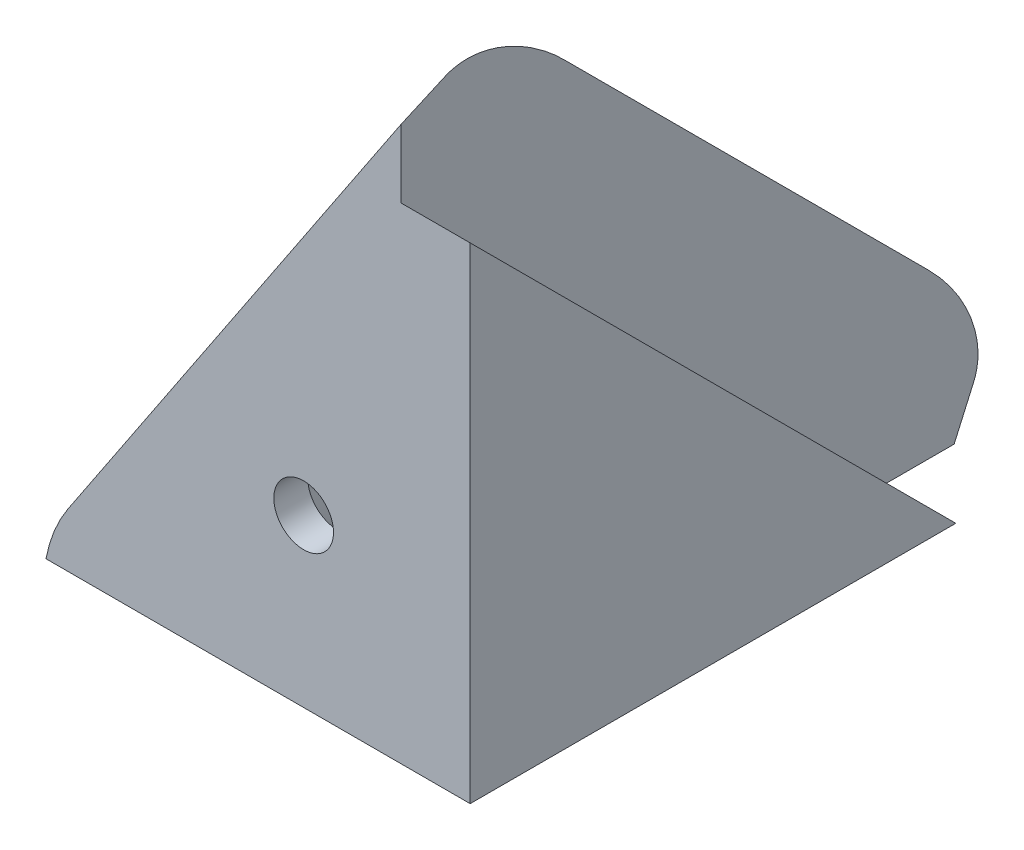
ISO-10303-21;
HEADER;
FILE_DESCRIPTION(('STEP AP214'),'2;1');
FILE_NAME('part.step','',(''),(''),'','','');
FILE_SCHEMA(('AUTOMOTIVE_DESIGN { 1 0 10303 214 1 1 1 1 }'));
ENDSEC;
DATA;
#1=APPLICATION_CONTEXT('core data for automotive mechanical design processes');
#2=APPLICATION_PROTOCOL_DEFINITION('international standard','automotive_design',2000,#1);
#3=PRODUCT_CONTEXT('',#1,'mechanical');
#4=PRODUCT('Part','Part','',(#3));
#5=PRODUCT_RELATED_PRODUCT_CATEGORY('part','',(#4));
#6=PRODUCT_DEFINITION_FORMATION('','',#4);
#7=PRODUCT_DEFINITION_CONTEXT('part definition',#1,'design');
#8=PRODUCT_DEFINITION('design','',#6,#7);
#9=PRODUCT_DEFINITION_SHAPE('','',#8);
#10=(LENGTH_UNIT() NAMED_UNIT(*) SI_UNIT(.MILLI.,.METRE.));
#11=(NAMED_UNIT(*) PLANE_ANGLE_UNIT() SI_UNIT($,.RADIAN.));
#12=(NAMED_UNIT(*) SI_UNIT($,.STERADIAN.) SOLID_ANGLE_UNIT());
#13=UNCERTAINTY_MEASURE_WITH_UNIT(LENGTH_MEASURE(1.E-05),#10,'distance_accuracy_value','');
#14=(GEOMETRIC_REPRESENTATION_CONTEXT(3) GLOBAL_UNCERTAINTY_ASSIGNED_CONTEXT((#13)) GLOBAL_UNIT_ASSIGNED_CONTEXT((#10,
#11,#12)) REPRESENTATION_CONTEXT('',''));
#15=CARTESIAN_POINT('',(0.,0.,0.));
#16=DIRECTION('',(0.,0.,1.));
#17=DIRECTION('',(1.,0.,0.));
#18=AXIS2_PLACEMENT_3D('',#15,#16,#17);
#19=CARTESIAN_POINT('',(0.,0.,0.));
#20=DIRECTION('',(1.,0.,0.));
#21=DIRECTION('',(0.,0.,-1.));
#22=AXIS2_PLACEMENT_3D('',#19,#20,#21);
#23=PLANE('',#22);
#24=DIRECTION('',(0.,0.707106781186548,0.707106781186548));
#25=VECTOR('',#24,1.);
#26=CARTESIAN_POINT('',(0.,17.5,-17.5));
#27=LINE('',#26,#25);
#28=CARTESIAN_POINT('',(0.,0.,-35.));
#29=VERTEX_POINT('',#28);
#30=CARTESIAN_POINT('',(0.,35.,0.));
#31=VERTEX_POINT('',#30);
#32=EDGE_CURVE('E214',#29,#31,#27,.T.);
#33=ORIENTED_EDGE('',*,*,#32,.T.);
#34=DIRECTION('',(0.,-1.,0.));
#35=VECTOR('',#34,1.);
#36=CARTESIAN_POINT('',(0.,0.,0.));
#37=LINE('',#36,#35);
#38=CARTESIAN_POINT('',(0.,0.,0.));
#39=VERTEX_POINT('',#38);
#40=EDGE_CURVE('E67',#31,#39,#37,.T.);
#41=ORIENTED_EDGE('',*,*,#40,.T.);
#42=CARTESIAN_POINT('',(0.,0.,-35.));
#43=DIRECTION('',(0.,0.,1.));
#44=VECTOR('',#43,1.);
#45=LINE('',#42,#44);
#46=EDGE_CURVE('E306',#29,#39,#45,.T.);
#47=ORIENTED_EDGE('',*,*,#46,.F.);
#48=EDGE_LOOP('',(#33,#41,#47));
#49=FACE_BOUND('',#48,.T.);
#50=ADVANCED_FACE('F50',(#49),#23,.T.);
#51=CARTESIAN_POINT('',(0.,0.,0.));
#52=DIRECTION('',(0.,-1.,0.));
#53=DIRECTION('',(0.,0.,1.));
#54=AXIS2_PLACEMENT_3D('',#51,#52,#53);
#55=PLANE('',#54);
#56=CARTESIAN_POINT('',(-12.,0.,-12.));
#57=DIRECTION('',(0.,1.,0.));
#58=DIRECTION('',(0.,0.,1.));
#59=AXIS2_PLACEMENT_3D('',#56,#57,#58);
#60=CIRCLE('',#59,2.1);
#61=CARTESIAN_POINT('',(-12.,0.,-9.9));
#62=VERTEX_POINT('',#61);
#63=EDGE_CURVE('E284',#62,#62,#60,.T.);
#64=ORIENTED_EDGE('',*,*,#63,.T.);
#65=EDGE_LOOP('',(#64));
#66=FACE_BOUND('',#65,.T.);
#67=ORIENTED_EDGE('',*,*,#46,.T.);
#68=DIRECTION('',(-1.,0.,0.));
#69=VECTOR('',#68,1.);
#70=CARTESIAN_POINT('',(0.,0.,0.));
#71=LINE('',#70,#69);
#72=CARTESIAN_POINT('',(-30.5683885482844,0.,0.));
#73=VERTEX_POINT('',#72);
#74=EDGE_CURVE('E374',#39,#73,#71,.T.);
#75=ORIENTED_EDGE('',*,*,#74,.T.);
#76=CARTESIAN_POINT('',(-25.3989526645243,0.,0.));
#77=DIRECTION('',(0.,1.,0.));
#78=DIRECTION('',(-0.348060303070731,0.,0.937472146480263));
#79=AXIS2_PLACEMENT_3D('',#76,#77,#78);
#80=ELLIPSE('',#79,7.31068633663173,5.);
#81=CARTESIAN_POINT('',(-28.9958939606416,0.,-3.88672959491346));
#82=VERTEX_POINT('',#81);
#83=EDGE_CURVE('E341',#82,#73,#80,.T.);
#84=ORIENTED_EDGE('',*,*,#83,.F.);
#85=DIRECTION('',(-0.554700196225229,0.,0.832050294337844));
#86=VECTOR('',#85,1.);
#87=CARTESIAN_POINT('',(-21.8679556319427,0.,-14.5786370879618));
#88=LINE('',#87,#86);
#89=CARTESIAN_POINT('',(-5.,0.,-39.8805705358759));
#90=VERTEX_POINT('',#89);
#91=EDGE_CURVE('E335',#90,#82,#88,.T.);
#92=ORIENTED_EDGE('',*,*,#91,.F.);
#93=DIRECTION('',(0.,0.,-1.));
#94=VECTOR('',#93,1.);
#95=CARTESIAN_POINT('',(-5.,0.,0.));
#96=LINE('',#95,#94);
#97=CARTESIAN_POINT('',(-5.,0.,-35.));
#98=VERTEX_POINT('',#97);
#99=EDGE_CURVE('E208',#98,#90,#96,.T.);
#100=ORIENTED_EDGE('',*,*,#99,.F.);
#101=DIRECTION('',(1.,0.,0.));
#102=VECTOR('',#101,1.);
#103=CARTESIAN_POINT('',(-5.,0.,-35.));
#104=LINE('',#103,#102);
#105=EDGE_CURVE('E199',#98,#29,#104,.T.);
#106=ORIENTED_EDGE('',*,*,#105,.T.);
#107=EDGE_LOOP('',(#67,#75,#84,#92,#100,#106));
#108=FACE_BOUND('',#107,.T.);
#109=ADVANCED_FACE('F47',(#66,#108),#55,.T.);
#110=CARTESIAN_POINT('',(-5.,0.,0.));
#111=DIRECTION('',(1.,0.,0.));
#112=DIRECTION('',(0.,0.,-1.));
#113=AXIS2_PLACEMENT_3D('',#110,#111,#112);
#114=PLANE('',#113);
#115=DIRECTION('',(0.,-0.405101821340606,0.914271575816794));
#116=VECTOR('',#115,1.);
#117=CARTESIAN_POINT('',(-5.,39.1628031074705,1.61992448137227));
#118=LINE('',#117,#116);
#119=CARTESIAN_POINT('',(-5.,41.2894179989949,-3.17961836342447));
#120=VERTEX_POINT('',#119);
#121=CARTESIAN_POINT('',(-5.,39.8805705358759,0.));
#122=VERTEX_POINT('',#121);
#123=EDGE_CURVE('E197',#120,#122,#118,.T.);
#124=ORIENTED_EDGE('',*,*,#123,.T.);
#125=DIRECTION('',(0.,-1.,0.));
#126=VECTOR('',#125,1.);
#127=CARTESIAN_POINT('',(-5.,0.,0.));
#128=LINE('',#127,#126);
#129=CARTESIAN_POINT('',(-5.,35.,0.));
#130=VERTEX_POINT('',#129);
#131=EDGE_CURVE('E194',#122,#130,#128,.T.);
#132=ORIENTED_EDGE('',*,*,#131,.T.);
#133=DIRECTION('',(0.,0.707106781186548,0.707106781186548));
#134=VECTOR('',#133,1.);
#135=CARTESIAN_POINT('',(-5.,17.5,-17.5));
#136=LINE('',#135,#134);
#137=EDGE_CURVE('E202',#98,#130,#136,.T.);
#138=ORIENTED_EDGE('',*,*,#137,.F.);
#139=ORIENTED_EDGE('',*,*,#99,.T.);
#140=DIRECTION('',(0.,-0.914271575816795,0.405101821340604));
#141=VECTOR('',#140,1.);
#142=CARTESIAN_POINT('',(-5.,-9.37115503531224,-35.7283338555672));
#143=LINE('',#142,#141);
#144=CARTESIAN_POINT('',(-5.,3.17961836342447,-41.2894179989949));
#145=VERTEX_POINT('',#144);
#146=EDGE_CURVE('E230',#90,#145,#143,.F.);
#147=ORIENTED_EDGE('',*,*,#146,.T.);
#148=CARTESIAN_POINT('',(-5.,8.41301994640867,-34.3261285046927));
#149=DIRECTION('',(-1.,0.,0.));
#150=DIRECTION('',(0.,0.687278705338442,0.726393819624255));
#151=AXIS2_PLACEMENT_3D('',#148,#149,#150);
#152=ELLIPSE('',#151,8.82760606728839,5.);
#153=CARTESIAN_POINT('',(-5.,11.7446391366902,-38.071300771529));
#154=VERTEX_POINT('',#153);
#155=EDGE_CURVE('E229',#145,#154,#152,.F.);
#156=ORIENTED_EDGE('',*,*,#155,.T.);
#157=DIRECTION('',(0.,-0.707106781186548,-0.707106781186548));
#158=VECTOR('',#157,1.);
#159=CARTESIAN_POINT('',(-5.,24.9079699541096,-24.9079699541096));
#160=LINE('',#159,#158);
#161=CARTESIAN_POINT('',(-5.,38.071300771529,-11.7446391366902));
#162=VERTEX_POINT('',#161);
#163=EDGE_CURVE('E223',#154,#162,#160,.F.);
#164=ORIENTED_EDGE('',*,*,#163,.T.);
#165=CARTESIAN_POINT('',(-5.,34.3261285046927,-8.41301994640865));
#166=DIRECTION('',(-1.,0.,0.));
#167=DIRECTION('',(0.,-0.726393819624255,-0.687278705338442));
#168=AXIS2_PLACEMENT_3D('',#165,#166,#167);
#169=ELLIPSE('',#168,8.82760606728838,5.);
#170=EDGE_CURVE('E12',#162,#120,#169,.F.);
#171=ORIENTED_EDGE('',*,*,#170,.T.);
#172=EDGE_LOOP('',(#124,#132,#138,#139,#147,#156,#164,#171));
#173=FACE_BOUND('',#172,.T.);
#174=ADVANCED_FACE('F205',(#173),#114,.T.);
#175=CARTESIAN_POINT('',(-12.,12.,5.));
#176=DIRECTION('',(0.,0.,1.));
#177=DIRECTION('',(1.,0.,0.));
#178=AXIS2_PLACEMENT_3D('',#175,#176,#177);
#179=CYLINDRICAL_SURFACE('',#178,2.15);
#180=CARTESIAN_POINT('',(-12.,12.,-2.45));
#181=DIRECTION('',(0.,0.,1.));
#182=DIRECTION('',(1.,0.,0.));
#183=AXIS2_PLACEMENT_3D('',#180,#181,#182);
#184=CIRCLE('',#183,2.15);
#185=CARTESIAN_POINT('',(-9.85,12.,-2.45));
#186=VERTEX_POINT('',#185);
#187=EDGE_CURVE('E222',#186,#186,#184,.T.);
#188=ORIENTED_EDGE('',*,*,#187,.F.);
#189=EDGE_LOOP('',(#188));
#190=FACE_BOUND('',#189,.T.);
#191=CARTESIAN_POINT('',(-12.,12.,0.));
#192=DIRECTION('',(0.,0.,1.));
#193=DIRECTION('',(1.,0.,0.));
#194=AXIS2_PLACEMENT_3D('',#191,#192,#193);
#195=CIRCLE('',#194,2.15);
#196=CARTESIAN_POINT('',(-9.85,12.,0.));
#197=VERTEX_POINT('',#196);
#198=EDGE_CURVE('E207',#197,#197,#195,.F.);
#199=ORIENTED_EDGE('',*,*,#198,.F.);
#200=EDGE_LOOP('',(#199));
#201=FACE_BOUND('',#200,.T.);
#202=ADVANCED_FACE('F389',(#190,#201),#179,.F.);
#203=CARTESIAN_POINT('',(0.,25.0502525316942,-25.0502525316942));
#204=DIRECTION('',(0.0402110415282764,-0.706534879584586,0.706534879584586));
#205=DIRECTION('',(0.,-0.707106781186547,-0.707106781186547));
#206=AXIS2_PLACEMENT_3D('',#203,#204,#205);
#207=PLANE('',#206);
#208=DIRECTION('',(0.566404975696414,-0.56640497569641,-0.598640799655932));
#209=VECTOR('',#208,1.);
#210=CARTESIAN_POINT('',(-12.0796495610013,18.8242886976915,-30.5887268953539));
#211=LINE('',#210,#209);
#212=CARTESIAN_POINT('',(-6.85994340570037,13.6045825423906,-36.1055023490589));
#213=VERTEX_POINT('',#212);
#214=EDGE_CURVE('E725',#213,#154,#211,.T.);
#215=ORIENTED_EDGE('',*,*,#214,.F.);
#216=DIRECTION('',(0.,0.707106781186548,0.707106781186548));
#217=VECTOR('',#216,1.);
#218=CARTESIAN_POINT('',(-6.85994340570037,-5.14495755427527,-54.8550424457247));
#219=LINE('',#218,#217);
#220=CARTESIAN_POINT('',(-6.85994340570037,36.1055023490589,-13.6045825423906));
#221=VERTEX_POINT('',#220);
#222=EDGE_CURVE('E311',#213,#221,#219,.T.);
#223=ORIENTED_EDGE('',*,*,#222,.T.);
#224=DIRECTION('',(0.566404975696415,0.598640799655932,0.566404975696409));
#225=VECTOR('',#224,1.);
#226=CARTESIAN_POINT('',(-12.0796495610013,30.5887268953539,-18.8242886976915));
#227=LINE('',#226,#225);
#228=EDGE_CURVE('E717',#162,#221,#227,.F.);
#229=ORIENTED_EDGE('',*,*,#228,.F.);
#230=ORIENTED_EDGE('',*,*,#163,.F.);
#231=EDGE_LOOP('',(#215,#223,#229,#230));
#232=FACE_BOUND('',#231,.T.);
#233=ADVANCED_FACE('F392',(#232),#207,.F.);
#234=CARTESIAN_POINT('',(-21.8679556319427,0.,-14.5786370879618));
#235=DIRECTION('',(0.808003192842465,0.23867712375438,0.53866879522831));
#236=DIRECTION('',(-0.554700196225229,0.,0.832050294337844));
#237=AXIS2_PLACEMENT_3D('',#234,#235,#236);
#238=PLANE('',#237);
#239=ORIENTED_EDGE('',*,*,#91,.T.);
#240=DIRECTION('',(0.253926469367306,0.683930313758155,-0.683930313758154));
#241=VECTOR('',#240,1.);
#242=CARTESIAN_POINT('',(-26.6794518107825,6.23914872011261,-10.1258783150261));
#243=LINE('',#242,#241);
#244=CARTESIAN_POINT('',(-27.1395171905289,5.,-8.88672959491345));
#245=VERTEX_POINT('',#244);
#246=EDGE_CURVE('E708',#245,#82,#243,.F.);
#247=ORIENTED_EDGE('',*,*,#246,.F.);
#248=DIRECTION('',(-0.554700196225229,0.,0.832050294337844));
#249=VECTOR('',#248,1.);
#250=CARTESIAN_POINT('',(-22.8904640218647,5.,-15.2603093479098));
#251=LINE('',#250,#249);
#252=CARTESIAN_POINT('',(-9.,5.,-36.0960053807068));
#253=VERTEX_POINT('',#252);
#254=EDGE_CURVE('E353',#245,#253,#251,.F.);
#255=ORIENTED_EDGE('',*,*,#254,.T.);
#256=DIRECTION('',(0.,-0.914271575816795,0.405101821340604));
#257=VECTOR('',#256,1.);
#258=CARTESIAN_POINT('',(-9.,-7.14891655193227,-30.712978769488));
#259=LINE('',#258,#257);
#260=CARTESIAN_POINT('',(-9.,7.17961836342444,-37.0617658748596));
#261=VERTEX_POINT('',#260);
#262=EDGE_CURVE('E319',#253,#261,#259,.F.);
#263=ORIENTED_EDGE('',*,*,#262,.T.);
#264=DIRECTION('',(0.566404975696415,-0.56640497569641,-0.598640799655932));
#265=VECTOR('',#264,1.);
#266=CARTESIAN_POINT('',(-18.4483264210769,16.6279447845013,-27.0757065589623));
#267=LINE('',#266,#265);
#268=EDGE_CURVE('E707',#145,#261,#267,.F.);
#269=ORIENTED_EDGE('',*,*,#268,.F.);
#270=ORIENTED_EDGE('',*,*,#146,.F.);
#271=EDGE_LOOP('',(#239,#247,#255,#263,#269,#270));
#272=FACE_BOUND('',#271,.T.);
#273=ADVANCED_FACE('F428',(#272),#238,.F.);
#274=CARTESIAN_POINT('',(-23.6562709283298,15.7708472855532,-8.74474632195212));
#275=DIRECTION('',(-0.808003192842464,0.53866879522831,0.238677123754382));
#276=DIRECTION('',(0.554700196225229,0.832050294337844,0.));
#277=AXIS2_PLACEMENT_3D('',#274,#275,#276);
#278=PLANE('',#277);
#279=DIRECTION('',(-0.566404975696415,-0.598640799655932,-0.566404975696409));
#280=VECTOR('',#279,1.);
#281=CARTESIAN_POINT('',(-21.4232398935771,23.9314817436788,-19.6028582570014));
#282=LINE('',#281,#280);
#283=CARTESIAN_POINT('',(-9.,37.0617658748596,-7.17961836342443));
#284=VERTEX_POINT('',#283);
#285=EDGE_CURVE('E340',#284,#120,#282,.F.);
#286=ORIENTED_EDGE('',*,*,#285,.F.);
#287=DIRECTION('',(0.,-0.405101821340606,0.914271575816794));
#288=VECTOR('',#287,1.);
#289=CARTESIAN_POINT('',(-9.,34.1474480213914,-0.602314002007703));
#290=LINE('',#289,#288);
#291=CARTESIAN_POINT('',(-9.,36.0960053807069,-5.));
#292=VERTEX_POINT('',#291);
#293=EDGE_CURVE('E318',#284,#292,#290,.T.);
#294=ORIENTED_EDGE('',*,*,#293,.T.);
#295=DIRECTION('',(-0.554700196225229,-0.832050294337844,0.));
#296=VECTOR('',#295,1.);
#297=CARTESIAN_POINT('',(-22.8904640218647,15.2603093479098,-5.));
#298=LINE('',#297,#296);
#299=CARTESIAN_POINT('',(-27.1395171905289,8.88672959491345,-5.));
#300=VERTEX_POINT('',#299);
#301=EDGE_CURVE('E325',#292,#300,#298,.T.);
#302=ORIENTED_EDGE('',*,*,#301,.T.);
#303=DIRECTION('',(-0.253926469367306,-0.683930313758155,0.683930313758153));
#304=VECTOR('',#303,1.);
#305=CARTESIAN_POINT('',(-25.0690285072951,14.4634226363486,-10.5766930414351));
#306=LINE('',#305,#304);
#307=CARTESIAN_POINT('',(-28.9958939606416,3.88672959491342,0.));
#308=VERTEX_POINT('',#307);
#309=EDGE_CURVE('E337',#308,#300,#306,.F.);
#310=ORIENTED_EDGE('',*,*,#309,.F.);
#311=DIRECTION('',(0.554700196225229,0.832050294337844,0.));
#312=VECTOR('',#311,1.);
#313=CARTESIAN_POINT('',(5.82435206036499,56.1170986264234,0.));
#314=LINE('',#313,#312);
#315=EDGE_CURVE('E328',#308,#122,#314,.T.);
#316=ORIENTED_EDGE('',*,*,#315,.T.);
#317=ORIENTED_EDGE('',*,*,#123,.F.);
#318=EDGE_LOOP('',(#286,#294,#302,#310,#316,#317));
#319=FACE_BOUND('',#318,.T.);
#320=ADVANCED_FACE('F424',(#319),#278,.T.);
#321=CARTESIAN_POINT('',(-14.4083104568646,17.8213304032732,-24.3823625828208));
#322=DIRECTION('',(-0.566404975696414,0.56640497569641,0.598640799655932));
#323=DIRECTION('',(-0.726393819624252,0.,-0.687278705338445));
#324=AXIS2_PLACEMENT_3D('',#321,#322,#323);
#325=CYLINDRICAL_SURFACE('',#324,5.);
#326=ORIENTED_EDGE('',*,*,#268,.T.);
#327=CARTESIAN_POINT('',(-9.,12.4130199464086,-30.0984763805574));
#328=DIRECTION('',(-1.,0.,0.));
#329=DIRECTION('',(0.,0.687278705338442,0.726393819624255));
#330=AXIS2_PLACEMENT_3D('',#327,#328,#329);
#331=ELLIPSE('',#330,8.82760606728839,5.);
#332=CARTESIAN_POINT('',(-9.,9.1386762863587,-37.3613237136413));
#333=VERTEX_POINT('',#332);
#334=EDGE_CURVE('E704',#261,#333,#331,.F.);
#335=ORIENTED_EDGE('',*,*,#334,.T.);
#336=CARTESIAN_POINT('',(-11.7638692322829,15.1768891786915,-27.1773069728842));
#337=DIRECTION('',(0.727606875108999,-0.485071250072666,0.485071250072666));
#338=DIRECTION('',(-0.302732240434554,0.407478411677827,0.861576772329658));
#339=AXIS2_PLACEMENT_3D('',#336,#337,#338);
#340=ELLIPSE('',#339,12.610865810412,5.);
#341=EDGE_CURVE('E720',#333,#213,#340,.T.);
#342=ORIENTED_EDGE('',*,*,#341,.T.);
#343=ORIENTED_EDGE('',*,*,#214,.T.);
#344=ORIENTED_EDGE('',*,*,#155,.F.);
#345=EDGE_LOOP('',(#326,#335,#342,#343,#344));
#346=FACE_BOUND('',#345,.T.);
#347=ADVANCED_FACE('F416',(#346),#325,.T.);
#348=CARTESIAN_POINT('',(-17.3832239293648,21.2381377675373,-20.7962438757733));
#349=DIRECTION('',(-0.566404975696415,-0.598640799655932,-0.566404975696409));
#350=DIRECTION('',(0.726393819624252,-0.687278705338446,0.));
#351=AXIS2_PLACEMENT_3D('',#348,#349,#350);
#352=CYLINDRICAL_SURFACE('',#351,5.);
#353=ORIENTED_EDGE('',*,*,#228,.T.);
#354=CARTESIAN_POINT('',(-11.7638692322829,27.1773069728842,-15.1768891786915));
#355=DIRECTION('',(0.727606875108999,-0.485071250072666,0.485071250072666));
#356=DIRECTION('',(-0.302732240434555,-0.861576772329658,-0.407478411677826));
#357=AXIS2_PLACEMENT_3D('',#354,#355,#356);
#358=ELLIPSE('',#357,12.610865810412,5.);
#359=CARTESIAN_POINT('',(-9.,37.3613237136413,-9.13867628635869));
#360=VERTEX_POINT('',#359);
#361=EDGE_CURVE('E714',#221,#360,#358,.T.);
#362=ORIENTED_EDGE('',*,*,#361,.T.);
#363=CARTESIAN_POINT('',(-9.,30.0984763805574,-12.4130199464086));
#364=DIRECTION('',(-1.,0.,0.));
#365=DIRECTION('',(0.,-0.726393819624255,-0.687278705338442));
#366=AXIS2_PLACEMENT_3D('',#363,#364,#365);
#367=ELLIPSE('',#366,8.82760606728838,5.);
#368=EDGE_CURVE('E713',#360,#284,#367,.F.);
#369=ORIENTED_EDGE('',*,*,#368,.T.);
#370=ORIENTED_EDGE('',*,*,#285,.T.);
#371=ORIENTED_EDGE('',*,*,#170,.F.);
#372=EDGE_LOOP('',(#353,#362,#369,#370,#371));
#373=FACE_BOUND('',#372,.T.);
#374=ADVANCED_FACE('F415',(#373),#352,.T.);
#375=CARTESIAN_POINT('',(-12.,-0.00500999999999974,-12.));
#376=DIRECTION('',(0.,1.,0.));
#377=DIRECTION('',(0.,0.,-1.));
#378=AXIS2_PLACEMENT_3D('',#375,#376,#377);
#379=CYLINDRICAL_SURFACE('',#378,2.1);
#380=ORIENTED_EDGE('',*,*,#63,.F.);
#381=EDGE_LOOP('',(#380));
#382=FACE_BOUND('',#381,.T.);
#383=CARTESIAN_POINT('',(-12.,2.5,-12.));
#384=DIRECTION('',(0.,-1.,0.));
#385=DIRECTION('',(0.,0.,-1.));
#386=AXIS2_PLACEMENT_3D('',#383,#384,#385);
#387=CIRCLE('',#386,2.1);
#388=CARTESIAN_POINT('',(-12.,2.5,-14.1));
#389=VERTEX_POINT('',#388);
#390=EDGE_CURVE('E273',#389,#389,#387,.F.);
#391=ORIENTED_EDGE('',*,*,#390,.T.);
#392=EDGE_LOOP('',(#391));
#393=FACE_BOUND('',#392,.T.);
#394=ADVANCED_FACE('F412',(#382,#393),#379,.F.);
#395=CARTESIAN_POINT('',(0.,0.,-60.));
#396=DIRECTION('',(-0.727606875108999,0.485071250072666,-0.485071250072666));
#397=DIRECTION('',(0.,0.707106781186547,0.707106781186547));
#398=AXIS2_PLACEMENT_3D('',#395,#396,#397);
#399=PLANE('',#398);
#400=DIRECTION('',(0.,-0.707106781186547,-0.707106781186547));
#401=VECTOR('',#400,1.);
#402=CARTESIAN_POINT('',(-9.,23.25,-23.25));
#403=LINE('',#402,#401);
#404=EDGE_CURVE('E301',#360,#333,#403,.T.);
#405=ORIENTED_EDGE('',*,*,#404,.F.);
#406=ORIENTED_EDGE('',*,*,#361,.F.);
#407=ORIENTED_EDGE('',*,*,#222,.F.);
#408=ORIENTED_EDGE('',*,*,#341,.F.);
#409=EDGE_LOOP('',(#405,#406,#407,#408));
#410=FACE_BOUND('',#409,.T.);
#411=ADVANCED_FACE('F440',(#410),#399,.T.);
#412=CARTESIAN_POINT('',(0.,0.,-5.));
#413=DIRECTION('',(0.,0.,-1.));
#414=DIRECTION('',(1.,0.,0.));
#415=AXIS2_PLACEMENT_3D('',#412,#413,#414);
#416=PLANE('',#415);
#417=CARTESIAN_POINT('',(-12.,12.,-5.));
#418=DIRECTION('',(0.,0.,1.));
#419=DIRECTION('',(1.,0.,0.));
#420=AXIS2_PLACEMENT_3D('',#417,#418,#419);
#421=CIRCLE('',#420,4.7);
#422=CARTESIAN_POINT('',(-7.3,12.,-5.));
#423=VERTEX_POINT('',#422);
#424=EDGE_CURVE('E372',#423,#423,#421,.T.);
#425=ORIENTED_EDGE('',*,*,#424,.T.);
#426=EDGE_LOOP('',(#425));
#427=FACE_BOUND('',#426,.T.);
#428=ORIENTED_EDGE('',*,*,#301,.F.);
#429=DIRECTION('',(0.,1.,0.));
#430=VECTOR('',#429,1.);
#431=CARTESIAN_POINT('',(-9.,0.,-5.));
#432=LINE('',#431,#430);
#433=CARTESIAN_POINT('',(-9.,22.5,-5.));
#434=VERTEX_POINT('',#433);
#435=EDGE_CURVE('E304',#434,#292,#432,.T.);
#436=ORIENTED_EDGE('',*,*,#435,.F.);
#437=DIRECTION('',(-1.,0.,0.));
#438=VECTOR('',#437,1.);
#439=CARTESIAN_POINT('',(-4.,22.5,-5.));
#440=LINE('',#439,#438);
#441=CARTESIAN_POINT('',(-4.,22.5,-5.));
#442=VERTEX_POINT('',#441);
#443=EDGE_CURVE('E299',#442,#434,#440,.T.);
#444=ORIENTED_EDGE('',*,*,#443,.F.);
#445=DIRECTION('',(0.,-1.,0.));
#446=VECTOR('',#445,1.);
#447=CARTESIAN_POINT('',(-4.,22.5,-5.));
#448=LINE('',#447,#446);
#449=CARTESIAN_POINT('',(-4.,5.,-5.));
#450=VERTEX_POINT('',#449);
#451=EDGE_CURVE('E290',#442,#450,#448,.T.);
#452=ORIENTED_EDGE('',*,*,#451,.T.);
#453=DIRECTION('',(1.,0.,0.));
#454=VECTOR('',#453,1.);
#455=CARTESIAN_POINT('',(0.,5.,-5.));
#456=LINE('',#455,#454);
#457=CARTESIAN_POINT('',(-28.7120117781717,5.,-5.));
#458=VERTEX_POINT('',#457);
#459=EDGE_CURVE('E305',#458,#450,#456,.T.);
#460=ORIENTED_EDGE('',*,*,#459,.F.);
#461=CARTESIAN_POINT('',(-23.5425758944116,4.99999999999999,-5.));
#462=DIRECTION('',(0.,0.,1.));
#463=DIRECTION('',(-0.34806030307073,-0.937472146480263,0.));
#464=AXIS2_PLACEMENT_3D('',#461,#462,#463);
#465=ELLIPSE('',#464,7.31068633663175,5.);
#466=EDGE_CURVE('E342',#300,#458,#465,.T.);
#467=ORIENTED_EDGE('',*,*,#466,.F.);
#468=EDGE_LOOP('',(#428,#436,#444,#452,#460,#467));
#469=FACE_BOUND('',#468,.T.);
#470=ADVANCED_FACE('F438',(#427,#469),#416,.T.);
#471=CARTESIAN_POINT('',(-9.,0.,0.));
#472=DIRECTION('',(1.,0.,0.));
#473=DIRECTION('',(0.,0.,1.));
#474=AXIS2_PLACEMENT_3D('',#471,#472,#473);
#475=PLANE('',#474);
#476=ORIENTED_EDGE('',*,*,#262,.F.);
#477=DIRECTION('',(0.,0.,1.));
#478=VECTOR('',#477,1.);
#479=CARTESIAN_POINT('',(-9.,5.,0.));
#480=LINE('',#479,#478);
#481=CARTESIAN_POINT('',(-9.,5.,-22.5));
#482=VERTEX_POINT('',#481);
#483=EDGE_CURVE('E298',#253,#482,#480,.T.);
#484=ORIENTED_EDGE('',*,*,#483,.T.);
#485=DIRECTION('',(0.,0.707106781186548,0.707106781186548));
#486=VECTOR('',#485,1.);
#487=CARTESIAN_POINT('',(-9.,22.5,-5.));
#488=LINE('',#487,#486);
#489=EDGE_CURVE('E287',#482,#434,#488,.T.);
#490=ORIENTED_EDGE('',*,*,#489,.T.);
#491=ORIENTED_EDGE('',*,*,#435,.T.);
#492=ORIENTED_EDGE('',*,*,#293,.F.);
#493=ORIENTED_EDGE('',*,*,#368,.F.);
#494=ORIENTED_EDGE('',*,*,#404,.T.);
#495=ORIENTED_EDGE('',*,*,#334,.F.);
#496=EDGE_LOOP('',(#476,#484,#490,#491,#492,#493,#494,#495));
#497=FACE_BOUND('',#496,.T.);
#498=ADVANCED_FACE('F447',(#497),#475,.F.);
#499=CARTESIAN_POINT('',(0.,5.,0.));
#500=DIRECTION('',(0.,-1.,0.));
#501=DIRECTION('',(0.,0.,-1.));
#502=AXIS2_PLACEMENT_3D('',#499,#500,#501);
#503=PLANE('',#502);
#504=DIRECTION('',(-0.866025403784439,0.,-0.5));
#505=VECTOR('',#504,1.);
#506=CARTESIAN_POINT('',(-12.,5.,-7.95854811567262));
#507=LINE('',#506,#505);
#508=CARTESIAN_POINT('',(-12.,5.,-7.95854811567262));
#509=VERTEX_POINT('',#508);
#510=CARTESIAN_POINT('',(-15.5,5.,-9.97927405783631));
#511=VERTEX_POINT('',#510);
#512=EDGE_CURVE('E257',#509,#511,#507,.T.);
#513=ORIENTED_EDGE('',*,*,#512,.T.);
#514=DIRECTION('',(0.,0.,-1.));
#515=VECTOR('',#514,1.);
#516=CARTESIAN_POINT('',(-15.5,5.,-9.97927405783631));
#517=LINE('',#516,#515);
#518=CARTESIAN_POINT('',(-15.5,5.,-14.0207259421637));
#519=VERTEX_POINT('',#518);
#520=EDGE_CURVE('E259',#511,#519,#517,.T.);
#521=ORIENTED_EDGE('',*,*,#520,.T.);
#522=DIRECTION('',(0.866025403784439,0.,-0.5));
#523=VECTOR('',#522,1.);
#524=CARTESIAN_POINT('',(-15.5,5.,-14.0207259421637));
#525=LINE('',#524,#523);
#526=CARTESIAN_POINT('',(-12.,5.,-16.0414518843274));
#527=VERTEX_POINT('',#526);
#528=EDGE_CURVE('E261',#519,#527,#525,.T.);
#529=ORIENTED_EDGE('',*,*,#528,.T.);
#530=DIRECTION('',(0.866025403784439,0.,0.5));
#531=VECTOR('',#530,1.);
#532=CARTESIAN_POINT('',(-12.,5.,-16.0414518843274));
#533=LINE('',#532,#531);
#534=CARTESIAN_POINT('',(-8.5,5.,-14.0207259421637));
#535=VERTEX_POINT('',#534);
#536=EDGE_CURVE('E266',#527,#535,#533,.T.);
#537=ORIENTED_EDGE('',*,*,#536,.T.);
#538=DIRECTION('',(0.,0.,1.));
#539=VECTOR('',#538,1.);
#540=CARTESIAN_POINT('',(-8.5,5.,-14.0207259421637));
#541=LINE('',#540,#539);
#542=CARTESIAN_POINT('',(-8.5,5.,-9.97927405783631));
#543=VERTEX_POINT('',#542);
#544=EDGE_CURVE('E236',#535,#543,#541,.T.);
#545=ORIENTED_EDGE('',*,*,#544,.T.);
#546=DIRECTION('',(-0.866025403784439,0.,0.5));
#547=VECTOR('',#546,1.);
#548=CARTESIAN_POINT('',(-8.5,5.,-9.97927405783631));
#549=LINE('',#548,#547);
#550=EDGE_CURVE('E235',#543,#509,#549,.T.);
#551=ORIENTED_EDGE('',*,*,#550,.T.);
#552=EDGE_LOOP('',(#513,#521,#529,#537,#545,#551));
#553=FACE_BOUND('',#552,.T.);
#554=ORIENTED_EDGE('',*,*,#459,.T.);
#555=DIRECTION('',(0.,0.,-1.));
#556=VECTOR('',#555,1.);
#557=CARTESIAN_POINT('',(-4.,5.,-5.));
#558=LINE('',#557,#556);
#559=CARTESIAN_POINT('',(-4.,5.,-22.5));
#560=VERTEX_POINT('',#559);
#561=EDGE_CURVE('E288',#450,#560,#558,.T.);
#562=ORIENTED_EDGE('',*,*,#561,.T.);
#563=DIRECTION('',(-1.,0.,0.));
#564=VECTOR('',#563,1.);
#565=CARTESIAN_POINT('',(-4.,5.,-22.5));
#566=LINE('',#565,#564);
#567=EDGE_CURVE('E293',#560,#482,#566,.T.);
#568=ORIENTED_EDGE('',*,*,#567,.T.);
#569=ORIENTED_EDGE('',*,*,#483,.F.);
#570=ORIENTED_EDGE('',*,*,#254,.F.);
#571=CARTESIAN_POINT('',(-23.5425758944116,5.,-5.00000000000001));
#572=DIRECTION('',(0.,1.,0.));
#573=DIRECTION('',(-0.348060303070731,0.,0.937472146480263));
#574=AXIS2_PLACEMENT_3D('',#571,#572,#573);
#575=ELLIPSE('',#574,7.31068633663173,5.);
#576=EDGE_CURVE('E350',#458,#245,#575,.F.);
#577=ORIENTED_EDGE('',*,*,#576,.F.);
#578=EDGE_LOOP('',(#554,#562,#568,#569,#570,#577));
#579=FACE_BOUND('',#578,.T.);
#580=ADVANCED_FACE('F444',(#553,#579),#503,.F.);
#581=CARTESIAN_POINT('',(-4.,22.5,-5.));
#582=DIRECTION('',(0.,0.707106781186548,-0.707106781186548));
#583=DIRECTION('',(0.,-0.707106781186548,-0.707106781186548));
#584=AXIS2_PLACEMENT_3D('',#581,#582,#583);
#585=PLANE('',#584);
#586=ORIENTED_EDGE('',*,*,#489,.F.);
#587=ORIENTED_EDGE('',*,*,#567,.F.);
#588=DIRECTION('',(0.,0.707106781186548,0.707106781186548));
#589=VECTOR('',#588,1.);
#590=CARTESIAN_POINT('',(-4.,22.5,-5.));
#591=LINE('',#590,#589);
#592=EDGE_CURVE('E295',#560,#442,#591,.T.);
#593=ORIENTED_EDGE('',*,*,#592,.T.);
#594=ORIENTED_EDGE('',*,*,#443,.T.);
#595=EDGE_LOOP('',(#586,#587,#593,#594));
#596=FACE_BOUND('',#595,.T.);
#597=ADVANCED_FACE('F443',(#596),#585,.F.);
#598=CARTESIAN_POINT('',(-4.,0.,0.));
#599=DIRECTION('',(-1.,0.,0.));
#600=DIRECTION('',(0.,0.,-1.));
#601=AXIS2_PLACEMENT_3D('',#598,#599,#600);
#602=PLANE('',#601);
#603=ORIENTED_EDGE('',*,*,#451,.F.);
#604=ORIENTED_EDGE('',*,*,#592,.F.);
#605=ORIENTED_EDGE('',*,*,#561,.F.);
#606=EDGE_LOOP('',(#603,#604,#605));
#607=FACE_BOUND('',#606,.T.);
#608=ADVANCED_FACE('F457',(#607),#602,.T.);
#609=CARTESIAN_POINT('',(0.,2.5,0.));
#610=DIRECTION('',(0.,1.,0.));
#611=DIRECTION('',(0.,0.,-1.));
#612=AXIS2_PLACEMENT_3D('',#609,#610,#611);
#613=PLANE('',#612);
#614=DIRECTION('',(-0.866025403784439,0.,0.5));
#615=VECTOR('',#614,1.);
#616=CARTESIAN_POINT('',(-8.5,2.5,-9.97927405783631));
#617=LINE('',#616,#615);
#618=CARTESIAN_POINT('',(-8.5,2.5,-9.97927405783631));
#619=VERTEX_POINT('',#618);
#620=CARTESIAN_POINT('',(-12.,2.5,-7.95854811567262));
#621=VERTEX_POINT('',#620);
#622=EDGE_CURVE('E233',#619,#621,#617,.T.);
#623=ORIENTED_EDGE('',*,*,#622,.F.);
#624=DIRECTION('',(0.,0.,1.));
#625=VECTOR('',#624,1.);
#626=CARTESIAN_POINT('',(-8.5,2.5,-14.0207259421637));
#627=LINE('',#626,#625);
#628=CARTESIAN_POINT('',(-8.5,2.5,-14.0207259421637));
#629=VERTEX_POINT('',#628);
#630=EDGE_CURVE('E253',#629,#619,#627,.T.);
#631=ORIENTED_EDGE('',*,*,#630,.F.);
#632=DIRECTION('',(0.866025403784439,0.,0.5));
#633=VECTOR('',#632,1.);
#634=CARTESIAN_POINT('',(-12.,2.5,-16.0414518843274));
#635=LINE('',#634,#633);
#636=CARTESIAN_POINT('',(-12.,2.5,-16.0414518843274));
#637=VERTEX_POINT('',#636);
#638=EDGE_CURVE('E250',#637,#629,#635,.T.);
#639=ORIENTED_EDGE('',*,*,#638,.F.);
#640=DIRECTION('',(0.866025403784439,0.,-0.5));
#641=VECTOR('',#640,1.);
#642=CARTESIAN_POINT('',(-15.5,2.5,-14.0207259421637));
#643=LINE('',#642,#641);
#644=CARTESIAN_POINT('',(-15.5,2.5,-14.0207259421637));
#645=VERTEX_POINT('',#644);
#646=EDGE_CURVE('E243',#645,#637,#643,.T.);
#647=ORIENTED_EDGE('',*,*,#646,.F.);
#648=DIRECTION('',(0.,0.,-1.));
#649=VECTOR('',#648,1.);
#650=CARTESIAN_POINT('',(-15.5,2.5,-9.97927405783631));
#651=LINE('',#650,#649);
#652=CARTESIAN_POINT('',(-15.5,2.5,-9.97927405783631));
#653=VERTEX_POINT('',#652);
#654=EDGE_CURVE('E244',#653,#645,#651,.T.);
#655=ORIENTED_EDGE('',*,*,#654,.F.);
#656=DIRECTION('',(-0.866025403784439,0.,-0.5));
#657=VECTOR('',#656,1.);
#658=CARTESIAN_POINT('',(-12.,2.5,-7.95854811567262));
#659=LINE('',#658,#657);
#660=EDGE_CURVE('E239',#621,#653,#659,.T.);
#661=ORIENTED_EDGE('',*,*,#660,.F.);
#662=EDGE_LOOP('',(#623,#631,#639,#647,#655,#661));
#663=FACE_BOUND('',#662,.T.);
#664=ORIENTED_EDGE('',*,*,#390,.F.);
#665=EDGE_LOOP('',(#664));
#666=FACE_BOUND('',#665,.T.);
#667=ADVANCED_FACE('F458',(#663,#666),#613,.T.);
#668=CARTESIAN_POINT('',(-8.5,2.5,-9.97927405783631));
#669=DIRECTION('',(0.5,0.,0.866025403784439));
#670=DIRECTION('',(-0.866025403784439,0.,0.5));
#671=AXIS2_PLACEMENT_3D('',#668,#669,#670);
#672=PLANE('',#671);
#673=ORIENTED_EDGE('',*,*,#550,.F.);
#674=DIRECTION('',(0.,1.,0.));
#675=VECTOR('',#674,1.);
#676=CARTESIAN_POINT('',(-8.5,2.5,-9.97927405783631));
#677=LINE('',#676,#675);
#678=EDGE_CURVE('E271',#619,#543,#677,.T.);
#679=ORIENTED_EDGE('',*,*,#678,.F.);
#680=ORIENTED_EDGE('',*,*,#622,.T.);
#681=DIRECTION('',(0.,1.,0.));
#682=VECTOR('',#681,1.);
#683=CARTESIAN_POINT('',(-12.,2.5,-7.95854811567262));
#684=LINE('',#683,#682);
#685=EDGE_CURVE('E255',#621,#509,#684,.T.);
#686=ORIENTED_EDGE('',*,*,#685,.T.);
#687=EDGE_LOOP('',(#673,#679,#680,#686));
#688=FACE_BOUND('',#687,.T.);
#689=ADVANCED_FACE('F463',(#688),#672,.F.);
#690=CARTESIAN_POINT('',(-8.5,2.5,-14.0207259421637));
#691=DIRECTION('',(1.,0.,0.));
#692=DIRECTION('',(0.,0.,1.));
#693=AXIS2_PLACEMENT_3D('',#690,#691,#692);
#694=PLANE('',#693);
#695=ORIENTED_EDGE('',*,*,#544,.F.);
#696=DIRECTION('',(0.,1.,0.));
#697=VECTOR('',#696,1.);
#698=CARTESIAN_POINT('',(-8.5,2.5,-14.0207259421637));
#699=LINE('',#698,#697);
#700=EDGE_CURVE('E272',#629,#535,#699,.T.);
#701=ORIENTED_EDGE('',*,*,#700,.F.);
#702=ORIENTED_EDGE('',*,*,#630,.T.);
#703=ORIENTED_EDGE('',*,*,#678,.T.);
#704=EDGE_LOOP('',(#695,#701,#702,#703));
#705=FACE_BOUND('',#704,.T.);
#706=ADVANCED_FACE('F470',(#705),#694,.F.);
#707=CARTESIAN_POINT('',(-12.,2.5,-16.0414518843274));
#708=DIRECTION('',(0.5,0.,-0.866025403784439));
#709=DIRECTION('',(0.866025403784439,0.,0.5));
#710=AXIS2_PLACEMENT_3D('',#707,#708,#709);
#711=PLANE('',#710);
#712=ORIENTED_EDGE('',*,*,#536,.F.);
#713=DIRECTION('',(0.,1.,0.));
#714=VECTOR('',#713,1.);
#715=CARTESIAN_POINT('',(-12.,2.5,-16.0414518843274));
#716=LINE('',#715,#714);
#717=EDGE_CURVE('E276',#637,#527,#716,.T.);
#718=ORIENTED_EDGE('',*,*,#717,.F.);
#719=ORIENTED_EDGE('',*,*,#638,.T.);
#720=ORIENTED_EDGE('',*,*,#700,.T.);
#721=EDGE_LOOP('',(#712,#718,#719,#720));
#722=FACE_BOUND('',#721,.T.);
#723=ADVANCED_FACE('F476',(#722),#711,.F.);
#724=CARTESIAN_POINT('',(-15.5,2.5,-14.0207259421637));
#725=DIRECTION('',(-0.5,0.,-0.866025403784438));
#726=DIRECTION('',(0.866025403784439,0.,-0.5));
#727=AXIS2_PLACEMENT_3D('',#724,#725,#726);
#728=PLANE('',#727);
#729=ORIENTED_EDGE('',*,*,#528,.F.);
#730=DIRECTION('',(0.,1.,0.));
#731=VECTOR('',#730,1.);
#732=CARTESIAN_POINT('',(-15.5,2.5,-14.0207259421637));
#733=LINE('',#732,#731);
#734=EDGE_CURVE('E277',#645,#519,#733,.T.);
#735=ORIENTED_EDGE('',*,*,#734,.F.);
#736=ORIENTED_EDGE('',*,*,#646,.T.);
#737=ORIENTED_EDGE('',*,*,#717,.T.);
#738=EDGE_LOOP('',(#729,#735,#736,#737));
#739=FACE_BOUND('',#738,.T.);
#740=ADVANCED_FACE('F478',(#739),#728,.F.);
#741=CARTESIAN_POINT('',(-15.5,2.5,-9.97927405783631));
#742=DIRECTION('',(-1.,0.,0.));
#743=DIRECTION('',(0.,0.,-1.));
#744=AXIS2_PLACEMENT_3D('',#741,#742,#743);
#745=PLANE('',#744);
#746=ORIENTED_EDGE('',*,*,#520,.F.);
#747=DIRECTION('',(0.,1.,0.));
#748=VECTOR('',#747,1.);
#749=CARTESIAN_POINT('',(-15.5,2.5,-9.97927405783631));
#750=LINE('',#749,#748);
#751=EDGE_CURVE('E279',#653,#511,#750,.T.);
#752=ORIENTED_EDGE('',*,*,#751,.F.);
#753=ORIENTED_EDGE('',*,*,#654,.T.);
#754=ORIENTED_EDGE('',*,*,#734,.T.);
#755=EDGE_LOOP('',(#746,#752,#753,#754));
#756=FACE_BOUND('',#755,.T.);
#757=ADVANCED_FACE('F474',(#756),#745,.F.);
#758=CARTESIAN_POINT('',(-12.,2.5,-7.95854811567262));
#759=DIRECTION('',(-0.5,0.,0.866025403784439));
#760=DIRECTION('',(-0.866025403784439,0.,-0.5));
#761=AXIS2_PLACEMENT_3D('',#758,#759,#760);
#762=PLANE('',#761);
#763=ORIENTED_EDGE('',*,*,#512,.F.);
#764=ORIENTED_EDGE('',*,*,#685,.F.);
#765=ORIENTED_EDGE('',*,*,#660,.T.);
#766=ORIENTED_EDGE('',*,*,#751,.T.);
#767=EDGE_LOOP('',(#763,#764,#765,#766));
#768=FACE_BOUND('',#767,.T.);
#769=ADVANCED_FACE('F421',(#768),#762,.F.);
#770=CARTESIAN_POINT('',(-21.0290125430827,11.770078660207,-11.770078660207));
#771=DIRECTION('',(-0.253926469367306,-0.683930313758155,0.683930313758153));
#772=DIRECTION('',(0.,0.707106781186547,0.707106781186548));
#773=AXIS2_PLACEMENT_3D('',#770,#771,#772);
#774=CYLINDRICAL_SURFACE('',#773,5.);
#775=ORIENTED_EDGE('',*,*,#83,.T.);
#776=CARTESIAN_POINT('',(-25.3989526645243,0.,0.));
#777=DIRECTION('',(0.,0.,1.));
#778=DIRECTION('',(-0.34806030307073,-0.937472146480263,0.));
#779=AXIS2_PLACEMENT_3D('',#776,#777,#778);
#780=ELLIPSE('',#779,7.31068633663175,5.);
#781=EDGE_CURVE('E59',#73,#308,#780,.F.);
#782=ORIENTED_EDGE('',*,*,#781,.T.);
#783=ORIENTED_EDGE('',*,*,#309,.T.);
#784=ORIENTED_EDGE('',*,*,#466,.T.);
#785=ORIENTED_EDGE('',*,*,#576,.T.);
#786=ORIENTED_EDGE('',*,*,#246,.T.);
#787=EDGE_LOOP('',(#775,#782,#783,#784,#785,#786));
#788=FACE_BOUND('',#787,.T.);
#789=ADVANCED_FACE('F418',(#788),#774,.T.);
#790=CARTESIAN_POINT('',(-5.,17.5,-17.5));
#791=DIRECTION('',(0.,-0.707106781186548,0.707106781186548));
#792=DIRECTION('',(0.,0.707106781186548,0.707106781186548));
#793=AXIS2_PLACEMENT_3D('',#790,#791,#792);
#794=PLANE('',#793);
#795=ORIENTED_EDGE('',*,*,#32,.F.);
#796=ORIENTED_EDGE('',*,*,#105,.F.);
#797=ORIENTED_EDGE('',*,*,#137,.T.);
#798=DIRECTION('',(1.,0.,0.));
#799=VECTOR('',#798,1.);
#800=CARTESIAN_POINT('',(-5.,35.,0.));
#801=LINE('',#800,#799);
#802=EDGE_CURVE('E191',#130,#31,#801,.T.);
#803=ORIENTED_EDGE('',*,*,#802,.T.);
#804=EDGE_LOOP('',(#795,#796,#797,#803));
#805=FACE_BOUND('',#804,.T.);
#806=ADVANCED_FACE('F206',(#805),#794,.F.);
#807=CARTESIAN_POINT('',(-12.,12.,-5.));
#808=DIRECTION('',(0.,0.,-1.));
#809=DIRECTION('',(1.,0.,0.));
#810=AXIS2_PLACEMENT_3D('',#807,#808,#809);
#811=CONICAL_SURFACE('',#810,4.7,0.785398163397448);
#812=ORIENTED_EDGE('',*,*,#187,.T.);
#813=EDGE_LOOP('',(#812));
#814=FACE_BOUND('',#813,.T.);
#815=ORIENTED_EDGE('',*,*,#424,.F.);
#816=EDGE_LOOP('',(#815));
#817=FACE_BOUND('',#816,.T.);
#818=ADVANCED_FACE('F383',(#814,#817),#811,.F.);
#819=CARTESIAN_POINT('',(0.,0.,0.));
#820=DIRECTION('',(0.,0.,1.));
#821=DIRECTION('',(1.,0.,0.));
#822=AXIS2_PLACEMENT_3D('',#819,#820,#821);
#823=PLANE('',#822);
#824=ORIENTED_EDGE('',*,*,#802,.F.);
#825=ORIENTED_EDGE('',*,*,#131,.F.);
#826=ORIENTED_EDGE('',*,*,#315,.F.);
#827=ORIENTED_EDGE('',*,*,#781,.F.);
#828=ORIENTED_EDGE('',*,*,#74,.F.);
#829=ORIENTED_EDGE('',*,*,#40,.F.);
#830=EDGE_LOOP('',(#824,#825,#826,#827,#828,#829));
#831=FACE_BOUND('',#830,.T.);
#832=ORIENTED_EDGE('',*,*,#198,.T.);
#833=EDGE_LOOP('',(#832));
#834=FACE_BOUND('',#833,.T.);
#835=ADVANCED_FACE('F193',(#831,#834),#823,.T.);
#836=CLOSED_SHELL('',(#50,#109,#174,#202,#233,#273,#320,#347,#374,#394,#411,#470,#498,#580,#597,
#608,#667,#689,#706,#723,#740,#757,#769,#789,#806,#818,#835));
#837=MANIFOLD_SOLID_BREP('B2',#836);
#838=ADVANCED_BREP_SHAPE_REPRESENTATION('',(#18,#837),#14);
#839=SHAPE_DEFINITION_REPRESENTATION(#9,#838);
ENDSEC;
END-ISO-10303-21;
